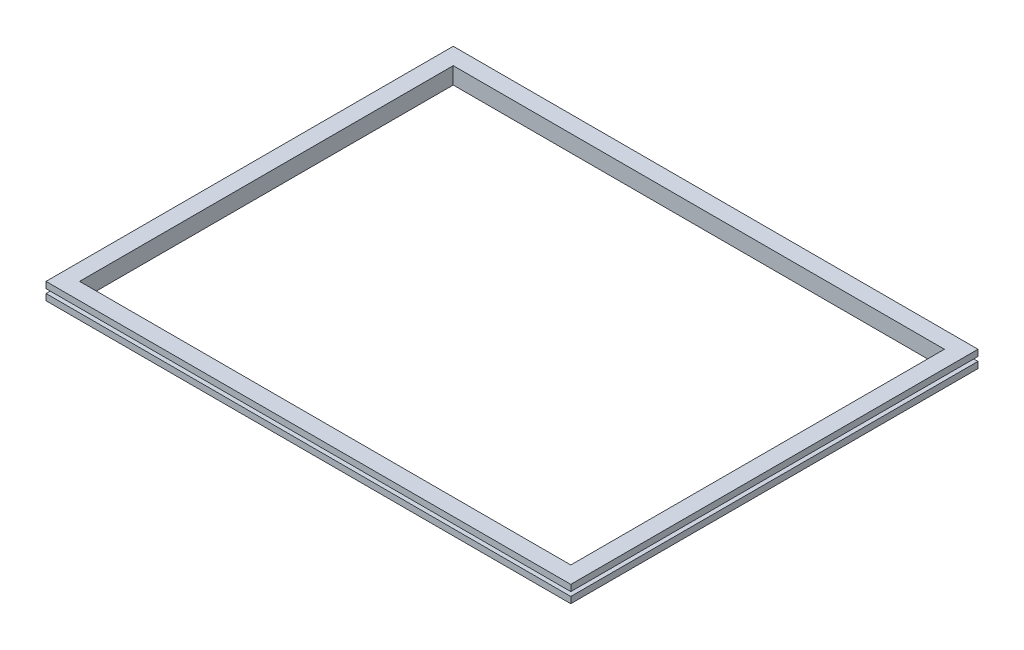
ISO-10303-21;
HEADER;
FILE_DESCRIPTION(('STEP AP214'),'2;1');
FILE_NAME('part.step','',(''),(''),'','','');
FILE_SCHEMA(('AUTOMOTIVE_DESIGN { 1 0 10303 214 1 1 1 1 }'));
ENDSEC;
DATA;
#1=APPLICATION_CONTEXT('core data for automotive mechanical design processes');
#2=APPLICATION_PROTOCOL_DEFINITION('international standard','automotive_design',2000,#1);
#3=PRODUCT_CONTEXT('',#1,'mechanical');
#4=PRODUCT('Part','Part','',(#3));
#5=PRODUCT_RELATED_PRODUCT_CATEGORY('part','',(#4));
#6=PRODUCT_DEFINITION_FORMATION('','',#4);
#7=PRODUCT_DEFINITION_CONTEXT('part definition',#1,'design');
#8=PRODUCT_DEFINITION('design','',#6,#7);
#9=PRODUCT_DEFINITION_SHAPE('','',#8);
#10=(LENGTH_UNIT() NAMED_UNIT(*) SI_UNIT(.MILLI.,.METRE.));
#11=(NAMED_UNIT(*) PLANE_ANGLE_UNIT() SI_UNIT($,.RADIAN.));
#12=(NAMED_UNIT(*) SI_UNIT($,.STERADIAN.) SOLID_ANGLE_UNIT());
#13=UNCERTAINTY_MEASURE_WITH_UNIT(LENGTH_MEASURE(1.E-05),#10,'distance_accuracy_value','');
#14=(GEOMETRIC_REPRESENTATION_CONTEXT(3) GLOBAL_UNCERTAINTY_ASSIGNED_CONTEXT((#13)) GLOBAL_UNIT_ASSIGNED_CONTEXT((#10,
#11,#12)) REPRESENTATION_CONTEXT('',''));
#15=CARTESIAN_POINT('',(0.,0.,0.));
#16=DIRECTION('',(0.,0.,1.));
#17=DIRECTION('',(1.,0.,0.));
#18=AXIS2_PLACEMENT_3D('',#15,#16,#17);
#19=CARTESIAN_POINT('',(625.,40.,485.));
#20=DIRECTION('',(0.,0.,-1.));
#21=DIRECTION('',(-1.,0.,0.));
#22=AXIS2_PLACEMENT_3D('',#19,#20,#21);
#23=PLANE('',#22);
#24=DIRECTION('',(0.,-1.,0.));
#25=VECTOR('',#24,1.);
#26=CARTESIAN_POINT('',(625.,40.,485.));
#27=LINE('',#26,#25);
#28=CARTESIAN_POINT('',(625.,15.,485.));
#29=VERTEX_POINT('',#28);
#30=CARTESIAN_POINT('',(625.,0.,485.));
#31=VERTEX_POINT('',#30);
#32=EDGE_CURVE('E284',#29,#31,#27,.T.);
#33=ORIENTED_EDGE('',*,*,#32,.F.);
#34=DIRECTION('',(-1.,0.,0.));
#35=VECTOR('',#34,1.);
#36=CARTESIAN_POINT('',(625.,15.,485.));
#37=LINE('',#36,#35);
#38=CARTESIAN_POINT('',(-625.,15.,485.));
#39=VERTEX_POINT('',#38);
#40=EDGE_CURVE('E201',#29,#39,#37,.T.);
#41=ORIENTED_EDGE('',*,*,#40,.T.);
#42=DIRECTION('',(0.,-1.,0.));
#43=VECTOR('',#42,1.);
#44=CARTESIAN_POINT('',(-625.,40.,485.));
#45=LINE('',#44,#43);
#46=CARTESIAN_POINT('',(-625.,0.,485.));
#47=VERTEX_POINT('',#46);
#48=EDGE_CURVE('E54',#39,#47,#45,.T.);
#49=ORIENTED_EDGE('',*,*,#48,.T.);
#50=DIRECTION('',(1.,0.,0.));
#51=VECTOR('',#50,1.);
#52=CARTESIAN_POINT('',(625.,0.,485.));
#53=LINE('',#52,#51);
#54=EDGE_CURVE('E265',#47,#31,#53,.T.);
#55=ORIENTED_EDGE('',*,*,#54,.T.);
#56=EDGE_LOOP('',(#33,#41,#49,#55));
#57=FACE_BOUND('',#56,.T.);
#58=ADVANCED_FACE('F45',(#57),#23,.F.);
#59=CARTESIAN_POINT('',(625.,40.,-485.));
#60=DIRECTION('',(0.,0.,1.));
#61=DIRECTION('',(1.,0.,0.));
#62=AXIS2_PLACEMENT_3D('',#59,#60,#61);
#63=PLANE('',#62);
#64=DIRECTION('',(0.,-1.,0.));
#65=VECTOR('',#64,1.);
#66=CARTESIAN_POINT('',(625.,40.,-485.));
#67=LINE('',#66,#65);
#68=CARTESIAN_POINT('',(625.,40.,-485.));
#69=VERTEX_POINT('',#68);
#70=CARTESIAN_POINT('',(625.,25.,-485.));
#71=VERTEX_POINT('',#70);
#72=EDGE_CURVE('E281',#69,#71,#67,.T.);
#73=ORIENTED_EDGE('',*,*,#72,.T.);
#74=DIRECTION('',(-1.,0.,0.));
#75=VECTOR('',#74,1.);
#76=CARTESIAN_POINT('',(-625.,25.,-485.));
#77=LINE('',#76,#75);
#78=CARTESIAN_POINT('',(-625.,25.,-485.));
#79=VERTEX_POINT('',#78);
#80=EDGE_CURVE('E328',#71,#79,#77,.T.);
#81=ORIENTED_EDGE('',*,*,#80,.T.);
#82=DIRECTION('',(0.,-1.,0.));
#83=VECTOR('',#82,1.);
#84=CARTESIAN_POINT('',(-625.,40.,-485.));
#85=LINE('',#84,#83);
#86=CARTESIAN_POINT('',(-625.,40.,-485.));
#87=VERTEX_POINT('',#86);
#88=EDGE_CURVE('E276',#87,#79,#85,.T.);
#89=ORIENTED_EDGE('',*,*,#88,.F.);
#90=DIRECTION('',(-1.,0.,0.));
#91=VECTOR('',#90,1.);
#92=CARTESIAN_POINT('',(625.,40.,-485.));
#93=LINE('',#92,#91);
#94=EDGE_CURVE('E258',#69,#87,#93,.T.);
#95=ORIENTED_EDGE('',*,*,#94,.F.);
#96=EDGE_LOOP('',(#73,#81,#89,#95));
#97=FACE_BOUND('',#96,.T.);
#98=ADVANCED_FACE('F362',(#97),#63,.F.);
#99=CARTESIAN_POINT('',(-625.,40.,485.));
#100=DIRECTION('',(1.,0.,0.));
#101=DIRECTION('',(0.,0.,-1.));
#102=AXIS2_PLACEMENT_3D('',#99,#100,#101);
#103=PLANE('',#102);
#104=ORIENTED_EDGE('',*,*,#48,.F.);
#105=DIRECTION('',(0.,0.,1.));
#106=VECTOR('',#105,1.);
#107=CARTESIAN_POINT('',(-625.,15.,-485.));
#108=LINE('',#107,#106);
#109=CARTESIAN_POINT('',(-625.,15.,-485.));
#110=VERTEX_POINT('',#109);
#111=EDGE_CURVE('E317',#110,#39,#108,.T.);
#112=ORIENTED_EDGE('',*,*,#111,.F.);
#113=CARTESIAN_POINT('',(-625.,0.,-485.));
#114=VERTEX_POINT('',#113);
#115=EDGE_CURVE('E261',#110,#114,#85,.T.);
#116=ORIENTED_EDGE('',*,*,#115,.T.);
#117=DIRECTION('',(0.,0.,1.));
#118=VECTOR('',#117,1.);
#119=CARTESIAN_POINT('',(-625.,0.,485.));
#120=LINE('',#119,#118);
#121=EDGE_CURVE('E246',#114,#47,#120,.T.);
#122=ORIENTED_EDGE('',*,*,#121,.T.);
#123=EDGE_LOOP('',(#104,#112,#116,#122));
#124=FACE_BOUND('',#123,.T.);
#125=ADVANCED_FACE('F367',(#124),#103,.F.);
#126=CARTESIAN_POINT('',(625.,40.,485.));
#127=DIRECTION('',(-1.,0.,0.));
#128=DIRECTION('',(0.,0.,1.));
#129=AXIS2_PLACEMENT_3D('',#126,#127,#128);
#130=PLANE('',#129);
#131=CARTESIAN_POINT('',(625.,15.,-485.));
#132=VERTEX_POINT('',#131);
#133=CARTESIAN_POINT('',(625.,0.,-485.));
#134=VERTEX_POINT('',#133);
#135=EDGE_CURVE('E280',#132,#134,#67,.T.);
#136=ORIENTED_EDGE('',*,*,#135,.F.);
#137=DIRECTION('',(0.,0.,1.));
#138=VECTOR('',#137,1.);
#139=CARTESIAN_POINT('',(625.,15.,-485.));
#140=LINE('',#139,#138);
#141=EDGE_CURVE('E189',#132,#29,#140,.T.);
#142=ORIENTED_EDGE('',*,*,#141,.T.);
#143=ORIENTED_EDGE('',*,*,#32,.T.);
#144=DIRECTION('',(0.,0.,-1.));
#145=VECTOR('',#144,1.);
#146=CARTESIAN_POINT('',(625.,0.,485.));
#147=LINE('',#146,#145);
#148=EDGE_CURVE('E269',#31,#134,#147,.T.);
#149=ORIENTED_EDGE('',*,*,#148,.T.);
#150=EDGE_LOOP('',(#136,#142,#143,#149));
#151=FACE_BOUND('',#150,.T.);
#152=ADVANCED_FACE('F297',(#151),#130,.F.);
#153=CARTESIAN_POINT('',(0.,40.,0.));
#154=DIRECTION('',(0.,1.,0.));
#155=DIRECTION('',(0.,0.,1.));
#156=AXIS2_PLACEMENT_3D('',#153,#154,#155);
#157=PLANE('',#156);
#158=DIRECTION('',(0.,0.,1.));
#159=VECTOR('',#158,1.);
#160=CARTESIAN_POINT('',(-625.,40.,485.));
#161=LINE('',#160,#159);
#162=CARTESIAN_POINT('',(-625.,40.,485.));
#163=VERTEX_POINT('',#162);
#164=EDGE_CURVE('E247',#87,#163,#161,.T.);
#165=ORIENTED_EDGE('',*,*,#164,.T.);
#166=DIRECTION('',(1.,0.,0.));
#167=VECTOR('',#166,1.);
#168=CARTESIAN_POINT('',(625.,40.,485.));
#169=LINE('',#168,#167);
#170=CARTESIAN_POINT('',(625.,40.,485.));
#171=VERTEX_POINT('',#170);
#172=EDGE_CURVE('E251',#163,#171,#169,.T.);
#173=ORIENTED_EDGE('',*,*,#172,.T.);
#174=DIRECTION('',(0.,0.,-1.));
#175=VECTOR('',#174,1.);
#176=CARTESIAN_POINT('',(625.,40.,485.));
#177=LINE('',#176,#175);
#178=EDGE_CURVE('E255',#171,#69,#177,.T.);
#179=ORIENTED_EDGE('',*,*,#178,.T.);
#180=ORIENTED_EDGE('',*,*,#94,.T.);
#181=EDGE_LOOP('',(#165,#173,#179,#180));
#182=FACE_BOUND('',#181,.T.);
#183=DIRECTION('',(1.,0.,0.));
#184=VECTOR('',#183,1.);
#185=CARTESIAN_POINT('',(585.,40.,445.));
#186=LINE('',#185,#184);
#187=CARTESIAN_POINT('',(-585.,40.,445.));
#188=VERTEX_POINT('',#187);
#189=CARTESIAN_POINT('',(585.,40.,445.));
#190=VERTEX_POINT('',#189);
#191=EDGE_CURVE('E209',#188,#190,#186,.T.);
#192=ORIENTED_EDGE('',*,*,#191,.F.);
#193=DIRECTION('',(0.,0.,1.));
#194=VECTOR('',#193,1.);
#195=CARTESIAN_POINT('',(-585.,40.,445.));
#196=LINE('',#195,#194);
#197=CARTESIAN_POINT('',(-585.,40.,-445.));
#198=VERTEX_POINT('',#197);
#199=EDGE_CURVE('E206',#198,#188,#196,.T.);
#200=ORIENTED_EDGE('',*,*,#199,.F.);
#201=DIRECTION('',(-1.,0.,0.));
#202=VECTOR('',#201,1.);
#203=CARTESIAN_POINT('',(585.,40.,-445.));
#204=LINE('',#203,#202);
#205=CARTESIAN_POINT('',(585.,40.,-445.));
#206=VERTEX_POINT('',#205);
#207=EDGE_CURVE('E216',#206,#198,#204,.T.);
#208=ORIENTED_EDGE('',*,*,#207,.F.);
#209=DIRECTION('',(0.,0.,-1.));
#210=VECTOR('',#209,1.);
#211=CARTESIAN_POINT('',(585.,40.,445.));
#212=LINE('',#211,#210);
#213=EDGE_CURVE('E213',#190,#206,#212,.T.);
#214=ORIENTED_EDGE('',*,*,#213,.F.);
#215=EDGE_LOOP('',(#192,#200,#208,#214));
#216=FACE_BOUND('',#215,.T.);
#217=ADVANCED_FACE('F407',(#182,#216),#157,.T.);
#218=CARTESIAN_POINT('',(0.,0.,0.));
#219=DIRECTION('',(0.,1.,0.));
#220=DIRECTION('',(0.,0.,1.));
#221=AXIS2_PLACEMENT_3D('',#218,#219,#220);
#222=PLANE('',#221);
#223=ORIENTED_EDGE('',*,*,#121,.F.);
#224=DIRECTION('',(-1.,0.,0.));
#225=VECTOR('',#224,1.);
#226=CARTESIAN_POINT('',(625.,0.,-485.));
#227=LINE('',#226,#225);
#228=EDGE_CURVE('E252',#134,#114,#227,.T.);
#229=ORIENTED_EDGE('',*,*,#228,.F.);
#230=ORIENTED_EDGE('',*,*,#148,.F.);
#231=ORIENTED_EDGE('',*,*,#54,.F.);
#232=EDGE_LOOP('',(#223,#229,#230,#231));
#233=FACE_BOUND('',#232,.T.);
#234=DIRECTION('',(0.,0.,1.));
#235=VECTOR('',#234,1.);
#236=CARTESIAN_POINT('',(-585.,0.,445.));
#237=LINE('',#236,#235);
#238=CARTESIAN_POINT('',(-585.,0.,-445.));
#239=VERTEX_POINT('',#238);
#240=CARTESIAN_POINT('',(-585.,0.,445.));
#241=VERTEX_POINT('',#240);
#242=EDGE_CURVE('E205',#239,#241,#237,.T.);
#243=ORIENTED_EDGE('',*,*,#242,.T.);
#244=DIRECTION('',(1.,0.,0.));
#245=VECTOR('',#244,1.);
#246=CARTESIAN_POINT('',(585.,0.,445.));
#247=LINE('',#246,#245);
#248=CARTESIAN_POINT('',(585.,0.,445.));
#249=VERTEX_POINT('',#248);
#250=EDGE_CURVE('E223',#241,#249,#247,.T.);
#251=ORIENTED_EDGE('',*,*,#250,.T.);
#252=DIRECTION('',(0.,0.,-1.));
#253=VECTOR('',#252,1.);
#254=CARTESIAN_POINT('',(585.,0.,445.));
#255=LINE('',#254,#253);
#256=CARTESIAN_POINT('',(585.,0.,-445.));
#257=VERTEX_POINT('',#256);
#258=EDGE_CURVE('E227',#249,#257,#255,.T.);
#259=ORIENTED_EDGE('',*,*,#258,.T.);
#260=DIRECTION('',(-1.,0.,0.));
#261=VECTOR('',#260,1.);
#262=CARTESIAN_POINT('',(585.,0.,-445.));
#263=LINE('',#262,#261);
#264=EDGE_CURVE('E210',#257,#239,#263,.T.);
#265=ORIENTED_EDGE('',*,*,#264,.T.);
#266=EDGE_LOOP('',(#243,#251,#259,#265));
#267=FACE_BOUND('',#266,.T.);
#268=ADVANCED_FACE('F307',(#233,#267),#222,.F.);
#269=ORIENTED_EDGE('',*,*,#88,.T.);
#270=DIRECTION('',(0.,0.,1.));
#271=VECTOR('',#270,1.);
#272=CARTESIAN_POINT('',(-625.,25.,-485.));
#273=LINE('',#272,#271);
#274=CARTESIAN_POINT('',(-625.,25.,485.));
#275=VERTEX_POINT('',#274);
#276=EDGE_CURVE('E61',#79,#275,#273,.T.);
#277=ORIENTED_EDGE('',*,*,#276,.T.);
#278=EDGE_CURVE('E12',#163,#275,#45,.T.);
#279=ORIENTED_EDGE('',*,*,#278,.F.);
#280=ORIENTED_EDGE('',*,*,#164,.F.);
#281=EDGE_LOOP('',(#269,#277,#279,#280));
#282=FACE_BOUND('',#281,.T.);
#283=ADVANCED_FACE('F47',(#282),#103,.F.);
#284=DIRECTION('',(1.,0.,0.));
#285=VECTOR('',#284,1.);
#286=CARTESIAN_POINT('',(625.,24.9999999999996,485.));
#287=LINE('',#286,#285);
#288=CARTESIAN_POINT('',(625.,25.,485.));
#289=VERTEX_POINT('',#288);
#290=EDGE_CURVE('E198',#275,#289,#287,.T.);
#291=ORIENTED_EDGE('',*,*,#290,.T.);
#292=EDGE_CURVE('E285',#171,#289,#27,.T.);
#293=ORIENTED_EDGE('',*,*,#292,.F.);
#294=ORIENTED_EDGE('',*,*,#172,.F.);
#295=ORIENTED_EDGE('',*,*,#278,.T.);
#296=EDGE_LOOP('',(#291,#293,#294,#295));
#297=FACE_BOUND('',#296,.T.);
#298=ADVANCED_FACE('F363',(#297),#23,.F.);
#299=ORIENTED_EDGE('',*,*,#292,.T.);
#300=DIRECTION('',(0.,0.,1.));
#301=VECTOR('',#300,1.);
#302=CARTESIAN_POINT('',(625.,25.,-485.));
#303=LINE('',#302,#301);
#304=EDGE_CURVE('E193',#71,#289,#303,.T.);
#305=ORIENTED_EDGE('',*,*,#304,.F.);
#306=ORIENTED_EDGE('',*,*,#72,.F.);
#307=ORIENTED_EDGE('',*,*,#178,.F.);
#308=EDGE_LOOP('',(#299,#305,#306,#307));
#309=FACE_BOUND('',#308,.T.);
#310=ADVANCED_FACE('F372',(#309),#130,.F.);
#311=DIRECTION('',(1.,0.,0.));
#312=VECTOR('',#311,1.);
#313=CARTESIAN_POINT('',(-625.,15.,-485.));
#314=LINE('',#313,#312);
#315=EDGE_CURVE('E312',#110,#132,#314,.T.);
#316=ORIENTED_EDGE('',*,*,#315,.T.);
#317=ORIENTED_EDGE('',*,*,#135,.T.);
#318=ORIENTED_EDGE('',*,*,#228,.T.);
#319=ORIENTED_EDGE('',*,*,#115,.F.);
#320=EDGE_LOOP('',(#316,#317,#318,#319));
#321=FACE_BOUND('',#320,.T.);
#322=ADVANCED_FACE('F311',(#321),#63,.F.);
#323=CARTESIAN_POINT('',(-585.,40.,445.));
#324=DIRECTION('',(1.,0.,0.));
#325=DIRECTION('',(0.,0.,-1.));
#326=AXIS2_PLACEMENT_3D('',#323,#324,#325);
#327=PLANE('',#326);
#328=ORIENTED_EDGE('',*,*,#242,.F.);
#329=DIRECTION('',(0.,-1.,0.));
#330=VECTOR('',#329,1.);
#331=CARTESIAN_POINT('',(-585.,40.,-445.));
#332=LINE('',#331,#330);
#333=EDGE_CURVE('E219',#198,#239,#332,.T.);
#334=ORIENTED_EDGE('',*,*,#333,.F.);
#335=ORIENTED_EDGE('',*,*,#199,.T.);
#336=DIRECTION('',(0.,-1.,0.));
#337=VECTOR('',#336,1.);
#338=CARTESIAN_POINT('',(-585.,40.,445.));
#339=LINE('',#338,#337);
#340=EDGE_CURVE('E242',#188,#241,#339,.T.);
#341=ORIENTED_EDGE('',*,*,#340,.T.);
#342=EDGE_LOOP('',(#328,#334,#335,#341));
#343=FACE_BOUND('',#342,.T.);
#344=ADVANCED_FACE('F402',(#343),#327,.T.);
#345=CARTESIAN_POINT('',(585.,40.,445.));
#346=DIRECTION('',(0.,0.,-1.));
#347=DIRECTION('',(-1.,0.,0.));
#348=AXIS2_PLACEMENT_3D('',#345,#346,#347);
#349=PLANE('',#348);
#350=ORIENTED_EDGE('',*,*,#250,.F.);
#351=ORIENTED_EDGE('',*,*,#340,.F.);
#352=ORIENTED_EDGE('',*,*,#191,.T.);
#353=DIRECTION('',(0.,-1.,0.));
#354=VECTOR('',#353,1.);
#355=CARTESIAN_POINT('',(585.,40.,445.));
#356=LINE('',#355,#354);
#357=EDGE_CURVE('E239',#190,#249,#356,.T.);
#358=ORIENTED_EDGE('',*,*,#357,.T.);
#359=EDGE_LOOP('',(#350,#351,#352,#358));
#360=FACE_BOUND('',#359,.T.);
#361=ADVANCED_FACE('F398',(#360),#349,.T.);
#362=CARTESIAN_POINT('',(585.,40.,445.));
#363=DIRECTION('',(-1.,0.,0.));
#364=DIRECTION('',(0.,0.,1.));
#365=AXIS2_PLACEMENT_3D('',#362,#363,#364);
#366=PLANE('',#365);
#367=ORIENTED_EDGE('',*,*,#258,.F.);
#368=ORIENTED_EDGE('',*,*,#357,.F.);
#369=ORIENTED_EDGE('',*,*,#213,.T.);
#370=DIRECTION('',(0.,-1.,0.));
#371=VECTOR('',#370,1.);
#372=CARTESIAN_POINT('',(585.,40.,-445.));
#373=LINE('',#372,#371);
#374=EDGE_CURVE('E69',#206,#257,#373,.T.);
#375=ORIENTED_EDGE('',*,*,#374,.T.);
#376=EDGE_LOOP('',(#367,#368,#369,#375));
#377=FACE_BOUND('',#376,.T.);
#378=ADVANCED_FACE('F395',(#377),#366,.T.);
#379=CARTESIAN_POINT('',(585.,40.,-445.));
#380=DIRECTION('',(0.,0.,1.));
#381=DIRECTION('',(1.,0.,0.));
#382=AXIS2_PLACEMENT_3D('',#379,#380,#381);
#383=PLANE('',#382);
#384=ORIENTED_EDGE('',*,*,#264,.F.);
#385=ORIENTED_EDGE('',*,*,#374,.F.);
#386=ORIENTED_EDGE('',*,*,#207,.T.);
#387=ORIENTED_EDGE('',*,*,#333,.T.);
#388=EDGE_LOOP('',(#384,#385,#386,#387));
#389=FACE_BOUND('',#388,.T.);
#390=ADVANCED_FACE('F392',(#389),#383,.T.);
#391=CARTESIAN_POINT('',(615.,25.,-485.));
#392=DIRECTION('',(-1.,0.,0.));
#393=DIRECTION('',(0.,0.,1.));
#394=AXIS2_PLACEMENT_3D('',#391,#392,#393);
#395=PLANE('',#394);
#396=DIRECTION('',(0.,0.,1.));
#397=VECTOR('',#396,1.);
#398=CARTESIAN_POINT('',(615.,25.,-485.));
#399=LINE('',#398,#397);
#400=CARTESIAN_POINT('',(615.,25.,-475.));
#401=VERTEX_POINT('',#400);
#402=CARTESIAN_POINT('',(615.,25.,475.));
#403=VERTEX_POINT('',#402);
#404=EDGE_CURVE('E188',#401,#403,#399,.T.);
#405=ORIENTED_EDGE('',*,*,#404,.T.);
#406=DIRECTION('',(0.,-1.,0.));
#407=VECTOR('',#406,1.);
#408=CARTESIAN_POINT('',(615.,25.,475.));
#409=LINE('',#408,#407);
#410=CARTESIAN_POINT('',(615.,15.,475.));
#411=VERTEX_POINT('',#410);
#412=EDGE_CURVE('E186',#403,#411,#409,.T.);
#413=ORIENTED_EDGE('',*,*,#412,.T.);
#414=DIRECTION('',(0.,0.,1.));
#415=VECTOR('',#414,1.);
#416=CARTESIAN_POINT('',(615.,15.,-485.));
#417=LINE('',#416,#415);
#418=CARTESIAN_POINT('',(615.,15.,-475.));
#419=VERTEX_POINT('',#418);
#420=EDGE_CURVE('E178',#419,#411,#417,.T.);
#421=ORIENTED_EDGE('',*,*,#420,.F.);
#422=DIRECTION('',(0.,1.,0.));
#423=VECTOR('',#422,1.);
#424=CARTESIAN_POINT('',(615.,25.,-475.));
#425=LINE('',#424,#423);
#426=EDGE_CURVE('E158',#419,#401,#425,.T.);
#427=ORIENTED_EDGE('',*,*,#426,.T.);
#428=EDGE_LOOP('',(#405,#413,#421,#427));
#429=FACE_BOUND('',#428,.T.);
#430=ADVANCED_FACE('F185',(#429),#395,.F.);
#431=CARTESIAN_POINT('',(-615.,25.,-485.));
#432=DIRECTION('',(1.,0.,0.));
#433=DIRECTION('',(0.,0.,-1.));
#434=AXIS2_PLACEMENT_3D('',#431,#432,#433);
#435=PLANE('',#434);
#436=DIRECTION('',(0.,0.,1.));
#437=VECTOR('',#436,1.);
#438=CARTESIAN_POINT('',(-615.,15.,-485.));
#439=LINE('',#438,#437);
#440=CARTESIAN_POINT('',(-615.,15.,-475.));
#441=VERTEX_POINT('',#440);
#442=CARTESIAN_POINT('',(-615.,15.,475.));
#443=VERTEX_POINT('',#442);
#444=EDGE_CURVE('E180',#441,#443,#439,.T.);
#445=ORIENTED_EDGE('',*,*,#444,.T.);
#446=DIRECTION('',(0.,1.,0.));
#447=VECTOR('',#446,1.);
#448=CARTESIAN_POINT('',(-615.,25.,475.));
#449=LINE('',#448,#447);
#450=CARTESIAN_POINT('',(-615.,25.,475.));
#451=VERTEX_POINT('',#450);
#452=EDGE_CURVE('E170',#443,#451,#449,.T.);
#453=ORIENTED_EDGE('',*,*,#452,.T.);
#454=DIRECTION('',(0.,0.,1.));
#455=VECTOR('',#454,1.);
#456=CARTESIAN_POINT('',(-615.,25.,-485.));
#457=LINE('',#456,#455);
#458=CARTESIAN_POINT('',(-615.,25.,-475.));
#459=VERTEX_POINT('',#458);
#460=EDGE_CURVE('E322',#459,#451,#457,.T.);
#461=ORIENTED_EDGE('',*,*,#460,.F.);
#462=DIRECTION('',(0.,-1.,0.));
#463=VECTOR('',#462,1.);
#464=CARTESIAN_POINT('',(-615.,25.,-475.));
#465=LINE('',#464,#463);
#466=EDGE_CURVE('E171',#459,#441,#465,.T.);
#467=ORIENTED_EDGE('',*,*,#466,.T.);
#468=EDGE_LOOP('',(#445,#453,#461,#467));
#469=FACE_BOUND('',#468,.T.);
#470=ADVANCED_FACE('F349',(#469),#435,.F.);
#471=CARTESIAN_POINT('',(-625.,15.,-485.));
#472=DIRECTION('',(0.,-1.,0.));
#473=DIRECTION('',(0.,0.,-1.));
#474=AXIS2_PLACEMENT_3D('',#471,#472,#473);
#475=PLANE('',#474);
#476=ORIENTED_EDGE('',*,*,#40,.F.);
#477=ORIENTED_EDGE('',*,*,#141,.F.);
#478=ORIENTED_EDGE('',*,*,#315,.F.);
#479=ORIENTED_EDGE('',*,*,#111,.T.);
#480=EDGE_LOOP('',(#476,#477,#478,#479));
#481=FACE_BOUND('',#480,.T.);
#482=ORIENTED_EDGE('',*,*,#420,.T.);
#483=DIRECTION('',(-1.,0.,0.));
#484=VECTOR('',#483,1.);
#485=CARTESIAN_POINT('',(625.,15.,475.));
#486=LINE('',#485,#484);
#487=EDGE_CURVE('E341',#411,#443,#486,.T.);
#488=ORIENTED_EDGE('',*,*,#487,.T.);
#489=ORIENTED_EDGE('',*,*,#444,.F.);
#490=DIRECTION('',(-1.,0.,0.));
#491=VECTOR('',#490,1.);
#492=CARTESIAN_POINT('',(625.,15.,-475.));
#493=LINE('',#492,#491);
#494=EDGE_CURVE('E161',#419,#441,#493,.T.);
#495=ORIENTED_EDGE('',*,*,#494,.F.);
#496=EDGE_LOOP('',(#482,#488,#489,#495));
#497=FACE_BOUND('',#496,.T.);
#498=ADVANCED_FACE('F176',(#481,#497),#475,.F.);
#499=CARTESIAN_POINT('',(-625.,25.,-485.));
#500=DIRECTION('',(0.,1.,0.));
#501=DIRECTION('',(-1.,0.,0.));
#502=AXIS2_PLACEMENT_3D('',#499,#500,#501);
#503=PLANE('',#502);
#504=DIRECTION('',(-1.,0.,0.));
#505=VECTOR('',#504,1.);
#506=CARTESIAN_POINT('',(625.,25.,475.));
#507=LINE('',#506,#505);
#508=EDGE_CURVE('E182',#403,#451,#507,.T.);
#509=ORIENTED_EDGE('',*,*,#508,.F.);
#510=ORIENTED_EDGE('',*,*,#404,.F.);
#511=DIRECTION('',(-1.,0.,0.));
#512=VECTOR('',#511,1.);
#513=CARTESIAN_POINT('',(625.,25.,-475.));
#514=LINE('',#513,#512);
#515=EDGE_CURVE('E164',#401,#459,#514,.T.);
#516=ORIENTED_EDGE('',*,*,#515,.T.);
#517=ORIENTED_EDGE('',*,*,#460,.T.);
#518=EDGE_LOOP('',(#509,#510,#516,#517));
#519=FACE_BOUND('',#518,.T.);
#520=ORIENTED_EDGE('',*,*,#304,.T.);
#521=ORIENTED_EDGE('',*,*,#290,.F.);
#522=ORIENTED_EDGE('',*,*,#276,.F.);
#523=ORIENTED_EDGE('',*,*,#80,.F.);
#524=EDGE_LOOP('',(#520,#521,#522,#523));
#525=FACE_BOUND('',#524,.T.);
#526=ADVANCED_FACE('F353',(#519,#525),#503,.F.);
#527=CARTESIAN_POINT('',(625.,15.,-475.));
#528=DIRECTION('',(0.,0.,1.));
#529=DIRECTION('',(1.,0.,0.));
#530=AXIS2_PLACEMENT_3D('',#527,#528,#529);
#531=PLANE('',#530);
#532=ORIENTED_EDGE('',*,*,#494,.T.);
#533=ORIENTED_EDGE('',*,*,#466,.F.);
#534=ORIENTED_EDGE('',*,*,#515,.F.);
#535=ORIENTED_EDGE('',*,*,#426,.F.);
#536=EDGE_LOOP('',(#532,#533,#534,#535));
#537=FACE_BOUND('',#536,.T.);
#538=ADVANCED_FACE('F160',(#537),#531,.F.);
#539=CARTESIAN_POINT('',(625.,25.,475.));
#540=DIRECTION('',(0.,0.,-1.));
#541=DIRECTION('',(-1.,0.,0.));
#542=AXIS2_PLACEMENT_3D('',#539,#540,#541);
#543=PLANE('',#542);
#544=ORIENTED_EDGE('',*,*,#508,.T.);
#545=ORIENTED_EDGE('',*,*,#452,.F.);
#546=ORIENTED_EDGE('',*,*,#487,.F.);
#547=ORIENTED_EDGE('',*,*,#412,.F.);
#548=EDGE_LOOP('',(#544,#545,#546,#547));
#549=FACE_BOUND('',#548,.T.);
#550=ADVANCED_FACE('F354',(#549),#543,.F.);
#551=CLOSED_SHELL('',(#58,#98,#125,#152,#217,#268,#283,#298,#310,#322,#344,#361,#378,#390,#430,
#470,#498,#526,#538,#550));
#552=MANIFOLD_SOLID_BREP('B2',#551);
#553=ADVANCED_BREP_SHAPE_REPRESENTATION('',(#18,#552),#14);
#554=SHAPE_DEFINITION_REPRESENTATION(#9,#553);
ENDSEC;
END-ISO-10303-21;
